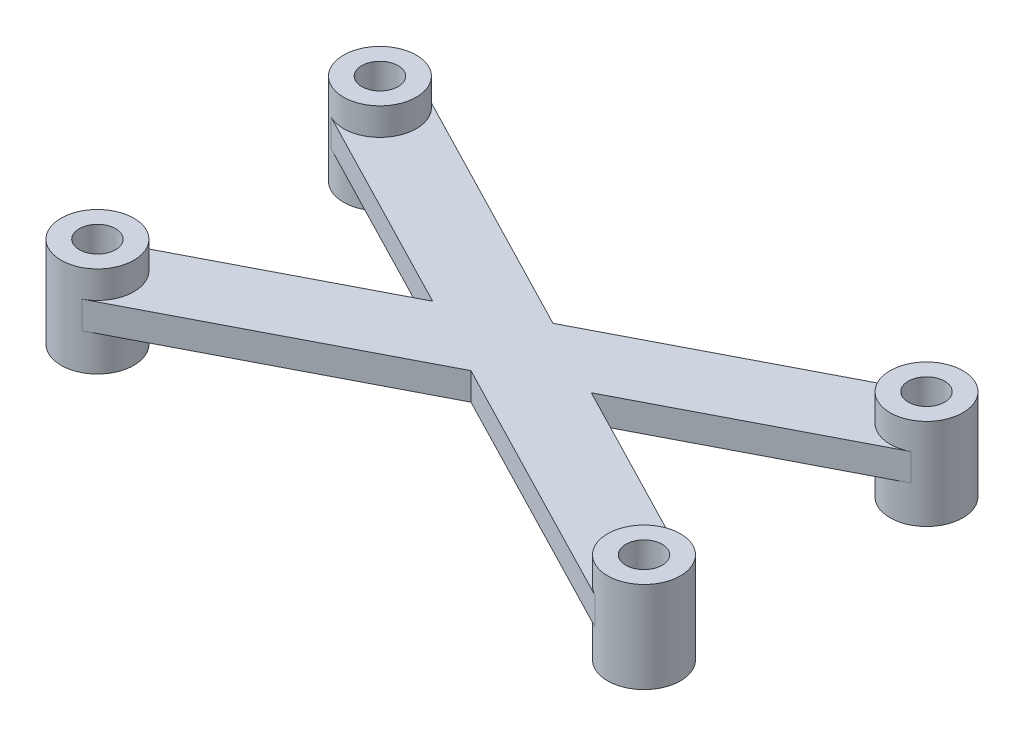
ISO-10303-21;
HEADER;
FILE_DESCRIPTION(('STEP AP214'),'2;1');
FILE_NAME('part.step','',(''),(''),'','','');
FILE_SCHEMA(('AUTOMOTIVE_DESIGN { 1 0 10303 214 1 1 1 1 }'));
ENDSEC;
DATA;
#1=APPLICATION_CONTEXT('core data for automotive mechanical design processes');
#2=APPLICATION_PROTOCOL_DEFINITION('international standard','automotive_design',2000,#1);
#3=PRODUCT_CONTEXT('',#1,'mechanical');
#4=PRODUCT('Part','Part','',(#3));
#5=PRODUCT_RELATED_PRODUCT_CATEGORY('part','',(#4));
#6=PRODUCT_DEFINITION_FORMATION('','',#4);
#7=PRODUCT_DEFINITION_CONTEXT('part definition',#1,'design');
#8=PRODUCT_DEFINITION('design','',#6,#7);
#9=PRODUCT_DEFINITION_SHAPE('','',#8);
#10=(LENGTH_UNIT() NAMED_UNIT(*) SI_UNIT(.MILLI.,.METRE.));
#11=(NAMED_UNIT(*) PLANE_ANGLE_UNIT() SI_UNIT($,.RADIAN.));
#12=(NAMED_UNIT(*) SI_UNIT($,.STERADIAN.) SOLID_ANGLE_UNIT());
#13=UNCERTAINTY_MEASURE_WITH_UNIT(LENGTH_MEASURE(1.E-05),#10,'distance_accuracy_value','');
#14=(GEOMETRIC_REPRESENTATION_CONTEXT(3) GLOBAL_UNCERTAINTY_ASSIGNED_CONTEXT((#13)) GLOBAL_UNIT_ASSIGNED_CONTEXT((#10,
#11,#12)) REPRESENTATION_CONTEXT('',''));
#15=CARTESIAN_POINT('',(0.,0.,0.));
#16=DIRECTION('',(0.,0.,1.));
#17=DIRECTION('',(1.,0.,0.));
#18=AXIS2_PLACEMENT_3D('',#15,#16,#17);
#19=CARTESIAN_POINT('',(0.,4.,0.));
#20=DIRECTION('',(0.,1.,0.));
#21=DIRECTION('',(0.,0.,1.));
#22=AXIS2_PLACEMENT_3D('',#19,#20,#21);
#23=PLANE('',#22);
#24=CARTESIAN_POINT('',(60.02,4.,31.02));
#25=DIRECTION('',(0.,1.,0.));
#26=DIRECTION('',(0.,0.,1.));
#27=AXIS2_PLACEMENT_3D('',#24,#25,#26);
#28=CIRCLE('',#27,4.);
#29=CARTESIAN_POINT('',(61.8565319194737,4.,27.4665297934619));
#30=VERTEX_POINT('',#29);
#31=CARTESIAN_POINT('',(58.1834680805263,4.,34.5734702065381));
#32=VERTEX_POINT('',#31);
#33=EDGE_CURVE('E489',#30,#32,#28,.T.);
#34=ORIENTED_EDGE('',*,*,#33,.T.);
#35=DIRECTION('',(-0.888367551634533,0.,-0.459132979868431));
#36=VECTOR('',#35,1.);
#37=CARTESIAN_POINT('',(-1.83653191947372,4.,3.55347020653813));
#38=LINE('',#37,#36);
#39=CARTESIAN_POINT('',(30.01,4.,20.012640818702));
#40=VERTEX_POINT('',#39);
#41=EDGE_CURVE('E377',#32,#40,#38,.T.);
#42=ORIENTED_EDGE('',*,*,#41,.T.);
#43=DIRECTION('',(0.888367551634533,0.,-0.459132979868431));
#44=VECTOR('',#43,1.);
#45=CARTESIAN_POINT('',(14.4889335735097,4.,28.0343582553853));
#46=LINE('',#45,#44);
#47=CARTESIAN_POINT('',(1.83653191947373,4.,34.5734702065381));
#48=VERTEX_POINT('',#47);
#49=EDGE_CURVE('E373',#48,#40,#46,.T.);
#50=ORIENTED_EDGE('',*,*,#49,.F.);
#51=CARTESIAN_POINT('',(0.,4.,31.02));
#52=DIRECTION('',(0.,1.,0.));
#53=DIRECTION('',(0.,0.,1.));
#54=AXIS2_PLACEMENT_3D('',#51,#52,#53);
#55=CIRCLE('',#54,4.);
#56=CARTESIAN_POINT('',(-1.83653191947371,4.,27.4665297934619));
#57=VERTEX_POINT('',#56);
#58=EDGE_CURVE('E512',#48,#57,#55,.T.);
#59=ORIENTED_EDGE('',*,*,#58,.T.);
#60=DIRECTION('',(0.888367551634533,0.,-0.459132979868431));
#61=VECTOR('',#60,1.);
#62=CARTESIAN_POINT('',(10.8158697345622,4.,20.927417842309));
#63=LINE('',#62,#61);
#64=CARTESIAN_POINT('',(21.2979270812865,4.,15.51));
#65=VERTEX_POINT('',#64);
#66=EDGE_CURVE('E368',#57,#65,#63,.T.);
#67=ORIENTED_EDGE('',*,*,#66,.T.);
#68=DIRECTION('',(0.888367551634533,0.,0.459132979868431));
#69=VECTOR('',#68,1.);
#70=CARTESIAN_POINT('',(-1.83653191947372,4.,3.55347020653813));
#71=LINE('',#70,#69);
#72=CARTESIAN_POINT('',(-1.83653191947372,4.,3.55347020653813));
#73=VERTEX_POINT('',#72);
#74=EDGE_CURVE('E364',#73,#65,#71,.T.);
#75=ORIENTED_EDGE('',*,*,#74,.F.);
#76=CARTESIAN_POINT('',(0.,4.,0.));
#77=DIRECTION('',(0.,1.,0.));
#78=DIRECTION('',(0.,0.,1.));
#79=AXIS2_PLACEMENT_3D('',#76,#77,#78);
#80=CIRCLE('',#79,4.);
#81=CARTESIAN_POINT('',(1.83653191947372,4.,-3.55347020653813));
#82=VERTEX_POINT('',#81);
#83=EDGE_CURVE('E263',#73,#82,#80,.T.);
#84=ORIENTED_EDGE('',*,*,#83,.T.);
#85=DIRECTION('',(0.888367551634533,0.,0.459132979868431));
#86=VECTOR('',#85,1.);
#87=CARTESIAN_POINT('',(1.83653191947372,4.,-3.55347020653813));
#88=LINE('',#87,#86);
#89=CARTESIAN_POINT('',(30.01,4.,11.007359181298));
#90=VERTEX_POINT('',#89);
#91=EDGE_CURVE('E392',#82,#90,#88,.T.);
#92=ORIENTED_EDGE('',*,*,#91,.T.);
#93=DIRECTION('',(-0.888367551634533,0.,0.459132979868431));
#94=VECTOR('',#93,1.);
#95=CARTESIAN_POINT('',(10.8158697345622,4.,20.927417842309));
#96=LINE('',#95,#94);
#97=CARTESIAN_POINT('',(58.1834680805263,4.,-3.55347020653813));
#98=VERTEX_POINT('',#97);
#99=EDGE_CURVE('E389',#98,#90,#96,.T.);
#100=ORIENTED_EDGE('',*,*,#99,.F.);
#101=CARTESIAN_POINT('',(60.02,4.,0.));
#102=DIRECTION('',(0.,1.,0.));
#103=DIRECTION('',(0.,0.,1.));
#104=AXIS2_PLACEMENT_3D('',#101,#102,#103);
#105=CIRCLE('',#104,4.00000000000001);
#106=CARTESIAN_POINT('',(61.8565319194737,4.,3.55347020653813));
#107=VERTEX_POINT('',#106);
#108=EDGE_CURVE('E343',#98,#107,#105,.T.);
#109=ORIENTED_EDGE('',*,*,#108,.T.);
#110=DIRECTION('',(-0.888367551634533,0.,0.459132979868431));
#111=VECTOR('',#110,1.);
#112=CARTESIAN_POINT('',(14.4889335735097,4.,28.0343582553853));
#113=LINE('',#112,#111);
#114=CARTESIAN_POINT('',(38.7220729187136,4.,15.51));
#115=VERTEX_POINT('',#114);
#116=EDGE_CURVE('E385',#107,#115,#113,.T.);
#117=ORIENTED_EDGE('',*,*,#116,.T.);
#118=DIRECTION('',(-0.888367551634533,0.,-0.459132979868431));
#119=VECTOR('',#118,1.);
#120=CARTESIAN_POINT('',(1.83653191947374,4.,-3.55347020653815));
#121=LINE('',#120,#119);
#122=EDGE_CURVE('E381',#30,#115,#121,.T.);
#123=ORIENTED_EDGE('',*,*,#122,.F.);
#124=EDGE_LOOP('',(#34,#42,#50,#59,#67,#75,#84,#92,#100,#109,#117,#123));
#125=FACE_BOUND('',#124,.T.);
#126=ADVANCED_FACE('F245',(#125),#23,.F.);
#127=CARTESIAN_POINT('',(0.,0.,0.));
#128=DIRECTION('',(0.,1.,0.));
#129=DIRECTION('',(0.,0.,1.));
#130=AXIS2_PLACEMENT_3D('',#127,#128,#129);
#131=PLANE('',#130);
#132=CARTESIAN_POINT('',(0.,0.,0.));
#133=DIRECTION('',(0.,1.,0.));
#134=DIRECTION('',(0.,0.,1.));
#135=AXIS2_PLACEMENT_3D('',#132,#133,#134);
#136=CIRCLE('',#135,4.);
#137=CARTESIAN_POINT('',(0.,0.,4.));
#138=VERTEX_POINT('',#137);
#139=EDGE_CURVE('E249',#138,#138,#136,.T.);
#140=ORIENTED_EDGE('',*,*,#139,.F.);
#141=EDGE_LOOP('',(#140));
#142=FACE_BOUND('',#141,.T.);
#143=CARTESIAN_POINT('',(0.,0.,0.));
#144=DIRECTION('',(0.,1.,0.));
#145=DIRECTION('',(0.,0.,1.));
#146=AXIS2_PLACEMENT_3D('',#143,#144,#145);
#147=CIRCLE('',#146,2.);
#148=CARTESIAN_POINT('',(0.,0.,2.));
#149=VERTEX_POINT('',#148);
#150=EDGE_CURVE('E428',#149,#149,#147,.T.);
#151=ORIENTED_EDGE('',*,*,#150,.T.);
#152=EDGE_LOOP('',(#151));
#153=FACE_BOUND('',#152,.T.);
#154=ADVANCED_FACE('F438',(#142,#153),#131,.F.);
#155=CARTESIAN_POINT('',(0.,4.,0.));
#156=DIRECTION('',(0.,-1.,0.));
#157=DIRECTION('',(0.,0.,-1.));
#158=AXIS2_PLACEMENT_3D('',#155,#156,#157);
#159=CYLINDRICAL_SURFACE('',#158,4.);
#160=ORIENTED_EDGE('',*,*,#83,.F.);
#161=DIRECTION('',(0.,-1.,0.));
#162=VECTOR('',#161,1.);
#163=CARTESIAN_POINT('',(-1.83653191947372,7.,3.55347020653813));
#164=LINE('',#163,#162);
#165=CARTESIAN_POINT('',(-1.83653191947372,7.,3.55347020653813));
#166=VERTEX_POINT('',#165);
#167=EDGE_CURVE('E358',#166,#73,#164,.T.);
#168=ORIENTED_EDGE('',*,*,#167,.F.);
#169=CARTESIAN_POINT('',(0.,7.,0.));
#170=DIRECTION('',(0.,1.,0.));
#171=DIRECTION('',(0.,0.,1.));
#172=AXIS2_PLACEMENT_3D('',#169,#170,#171);
#173=CIRCLE('',#172,4.);
#174=CARTESIAN_POINT('',(1.83653191947372,7.,-3.55347020653813));
#175=VERTEX_POINT('',#174);
#176=EDGE_CURVE('E12',#166,#175,#173,.T.);
#177=ORIENTED_EDGE('',*,*,#176,.T.);
#178=DIRECTION('',(0.,-1.,0.));
#179=VECTOR('',#178,1.);
#180=CARTESIAN_POINT('',(1.83653191947372,7.,-3.55347020653813));
#181=LINE('',#180,#179);
#182=EDGE_CURVE('E397',#175,#82,#181,.T.);
#183=ORIENTED_EDGE('',*,*,#182,.T.);
#184=EDGE_LOOP('',(#160,#168,#177,#183));
#185=FACE_BOUND('',#184,.T.);
#186=ORIENTED_EDGE('',*,*,#139,.T.);
#187=EDGE_LOOP('',(#186));
#188=FACE_BOUND('',#187,.T.);
#189=CARTESIAN_POINT('',(0.,10.,0.));
#190=DIRECTION('',(0.,1.,0.));
#191=DIRECTION('',(0.,0.,1.));
#192=AXIS2_PLACEMENT_3D('',#189,#190,#191);
#193=CIRCLE('',#192,4.);
#194=CARTESIAN_POINT('',(0.,10.,4.));
#195=VERTEX_POINT('',#194);
#196=EDGE_CURVE('E454',#195,#195,#193,.T.);
#197=ORIENTED_EDGE('',*,*,#196,.F.);
#198=EDGE_LOOP('',(#197));
#199=FACE_BOUND('',#198,.T.);
#200=ADVANCED_FACE('F247',(#185,#188,#199),#159,.T.);
#201=CARTESIAN_POINT('',(0.,4.,0.));
#202=DIRECTION('',(0.,-1.,0.));
#203=DIRECTION('',(0.,0.,-1.));
#204=AXIS2_PLACEMENT_3D('',#201,#202,#203);
#205=CYLINDRICAL_SURFACE('',#204,2.);
#206=ORIENTED_EDGE('',*,*,#150,.F.);
#207=EDGE_LOOP('',(#206));
#208=FACE_BOUND('',#207,.T.);
#209=CARTESIAN_POINT('',(0.,10.,0.));
#210=DIRECTION('',(0.,1.,0.));
#211=DIRECTION('',(0.,0.,1.));
#212=AXIS2_PLACEMENT_3D('',#209,#210,#211);
#213=CIRCLE('',#212,2.);
#214=CARTESIAN_POINT('',(0.,10.,2.));
#215=VERTEX_POINT('',#214);
#216=EDGE_CURVE('E450',#215,#215,#213,.T.);
#217=ORIENTED_EDGE('',*,*,#216,.T.);
#218=EDGE_LOOP('',(#217));
#219=FACE_BOUND('',#218,.T.);
#220=ADVANCED_FACE('F443',(#208,#219),#205,.F.);
#221=CARTESIAN_POINT('',(60.02,7.,31.02));
#222=DIRECTION('',(0.,-1.,0.));
#223=DIRECTION('',(0.,0.,-1.));
#224=AXIS2_PLACEMENT_3D('',#221,#222,#223);
#225=CYLINDRICAL_SURFACE('',#224,2.);
#226=CARTESIAN_POINT('',(60.02,0.,31.02));
#227=DIRECTION('',(0.,1.,0.));
#228=DIRECTION('',(0.,0.,1.));
#229=AXIS2_PLACEMENT_3D('',#226,#227,#228);
#230=CIRCLE('',#229,2.);
#231=CARTESIAN_POINT('',(60.02,0.,33.02));
#232=VERTEX_POINT('',#231);
#233=EDGE_CURVE('E495',#232,#232,#230,.T.);
#234=ORIENTED_EDGE('',*,*,#233,.F.);
#235=EDGE_LOOP('',(#234));
#236=FACE_BOUND('',#235,.T.);
#237=CARTESIAN_POINT('',(60.02,10.,31.02));
#238=DIRECTION('',(0.,1.,0.));
#239=DIRECTION('',(0.,0.,1.));
#240=AXIS2_PLACEMENT_3D('',#237,#238,#239);
#241=CIRCLE('',#240,2.);
#242=CARTESIAN_POINT('',(60.02,10.,33.02));
#243=VERTEX_POINT('',#242);
#244=EDGE_CURVE('E472',#243,#243,#241,.T.);
#245=ORIENTED_EDGE('',*,*,#244,.T.);
#246=EDGE_LOOP('',(#245));
#247=FACE_BOUND('',#246,.T.);
#248=ADVANCED_FACE('F446',(#236,#247),#225,.F.);
#249=CARTESIAN_POINT('',(0.,7.,31.02));
#250=DIRECTION('',(0.,-1.,0.));
#251=DIRECTION('',(0.,0.,-1.));
#252=AXIS2_PLACEMENT_3D('',#249,#250,#251);
#253=CYLINDRICAL_SURFACE('',#252,2.);
#254=CARTESIAN_POINT('',(0.,0.,31.02));
#255=DIRECTION('',(0.,1.,0.));
#256=DIRECTION('',(0.,0.,1.));
#257=AXIS2_PLACEMENT_3D('',#254,#255,#256);
#258=CIRCLE('',#257,2.);
#259=CARTESIAN_POINT('',(0.,0.,33.02));
#260=VERTEX_POINT('',#259);
#261=EDGE_CURVE('E369',#260,#260,#258,.T.);
#262=ORIENTED_EDGE('',*,*,#261,.F.);
#263=EDGE_LOOP('',(#262));
#264=FACE_BOUND('',#263,.T.);
#265=CARTESIAN_POINT('',(0.,10.,31.02));
#266=DIRECTION('',(0.,1.,0.));
#267=DIRECTION('',(0.,0.,1.));
#268=AXIS2_PLACEMENT_3D('',#265,#266,#267);
#269=CIRCLE('',#268,2.);
#270=CARTESIAN_POINT('',(0.,10.,33.02));
#271=VERTEX_POINT('',#270);
#272=EDGE_CURVE('E462',#271,#271,#269,.T.);
#273=ORIENTED_EDGE('',*,*,#272,.T.);
#274=EDGE_LOOP('',(#273));
#275=FACE_BOUND('',#274,.T.);
#276=ADVANCED_FACE('F594',(#264,#275),#253,.F.);
#277=CARTESIAN_POINT('',(60.02,7.,0.));
#278=DIRECTION('',(0.,-1.,0.));
#279=DIRECTION('',(0.,0.,-1.));
#280=AXIS2_PLACEMENT_3D('',#277,#278,#279);
#281=CYLINDRICAL_SURFACE('',#280,2.);
#282=CARTESIAN_POINT('',(60.02,0.,0.));
#283=DIRECTION('',(0.,1.,0.));
#284=DIRECTION('',(0.,0.,1.));
#285=AXIS2_PLACEMENT_3D('',#282,#283,#284);
#286=CIRCLE('',#285,2.);
#287=CARTESIAN_POINT('',(60.02,0.,2.));
#288=VERTEX_POINT('',#287);
#289=EDGE_CURVE('E506',#288,#288,#286,.T.);
#290=ORIENTED_EDGE('',*,*,#289,.F.);
#291=EDGE_LOOP('',(#290));
#292=FACE_BOUND('',#291,.T.);
#293=CARTESIAN_POINT('',(60.02,10.,0.));
#294=DIRECTION('',(0.,1.,0.));
#295=DIRECTION('',(0.,0.,1.));
#296=AXIS2_PLACEMENT_3D('',#293,#294,#295);
#297=CIRCLE('',#296,2.);
#298=CARTESIAN_POINT('',(60.02,10.,2.));
#299=VERTEX_POINT('',#298);
#300=EDGE_CURVE('E453',#299,#299,#297,.T.);
#301=ORIENTED_EDGE('',*,*,#300,.T.);
#302=EDGE_LOOP('',(#301));
#303=FACE_BOUND('',#302,.T.);
#304=ADVANCED_FACE('F598',(#292,#303),#281,.F.);
#305=CARTESIAN_POINT('',(10.8158697345622,7.,20.927417842309));
#306=DIRECTION('',(-0.459132979868431,0.,-0.888367551634533));
#307=DIRECTION('',(-0.888367551634533,0.,0.459132979868431));
#308=AXIS2_PLACEMENT_3D('',#305,#306,#307);
#309=PLANE('',#308);
#310=ORIENTED_EDGE('',*,*,#66,.F.);
#311=DIRECTION('',(0.,-1.,0.));
#312=VECTOR('',#311,1.);
#313=CARTESIAN_POINT('',(-1.8365319194737,7.,27.4665297934619));
#314=LINE('',#313,#312);
#315=CARTESIAN_POINT('',(-1.8365319194737,7.,27.4665297934619));
#316=VERTEX_POINT('',#315);
#317=EDGE_CURVE('E421',#316,#57,#314,.T.);
#318=ORIENTED_EDGE('',*,*,#317,.F.);
#319=DIRECTION('',(0.888367551634533,0.,-0.459132979868431));
#320=VECTOR('',#319,1.);
#321=CARTESIAN_POINT('',(10.8158697345622,7.,20.927417842309));
#322=LINE('',#321,#320);
#323=CARTESIAN_POINT('',(21.2979270812865,7.,15.51));
#324=VERTEX_POINT('',#323);
#325=EDGE_CURVE('E525',#316,#324,#322,.T.);
#326=ORIENTED_EDGE('',*,*,#325,.T.);
#327=DIRECTION('',(0.,-1.,0.));
#328=VECTOR('',#327,1.);
#329=CARTESIAN_POINT('',(21.2979270812865,7.,15.51));
#330=LINE('',#329,#328);
#331=EDGE_CURVE('E425',#324,#65,#330,.T.);
#332=ORIENTED_EDGE('',*,*,#331,.T.);
#333=EDGE_LOOP('',(#310,#318,#326,#332));
#334=FACE_BOUND('',#333,.T.);
#335=ADVANCED_FACE('F566',(#334),#309,.T.);
#336=CARTESIAN_POINT('',(0.,7.,31.02));
#337=DIRECTION('',(0.,-1.,0.));
#338=DIRECTION('',(0.,0.,-1.));
#339=AXIS2_PLACEMENT_3D('',#336,#337,#338);
#340=CYLINDRICAL_SURFACE('',#339,4.);
#341=ORIENTED_EDGE('',*,*,#317,.T.);
#342=ORIENTED_EDGE('',*,*,#58,.F.);
#343=DIRECTION('',(0.,-1.,0.));
#344=VECTOR('',#343,1.);
#345=CARTESIAN_POINT('',(1.83653191947373,7.,34.5734702065381));
#346=LINE('',#345,#344);
#347=CARTESIAN_POINT('',(1.83653191947373,7.,34.5734702065381));
#348=VERTEX_POINT('',#347);
#349=EDGE_CURVE('E418',#348,#48,#346,.T.);
#350=ORIENTED_EDGE('',*,*,#349,.F.);
#351=CARTESIAN_POINT('',(0.,7.,31.02));
#352=DIRECTION('',(0.,1.,0.));
#353=DIRECTION('',(0.,0.,1.));
#354=AXIS2_PLACEMENT_3D('',#351,#352,#353);
#355=CIRCLE('',#354,3.99999999999999);
#356=EDGE_CURVE('E465',#348,#316,#355,.T.);
#357=ORIENTED_EDGE('',*,*,#356,.T.);
#358=EDGE_LOOP('',(#341,#342,#350,#357));
#359=FACE_BOUND('',#358,.T.);
#360=CARTESIAN_POINT('',(0.,0.,31.02));
#361=DIRECTION('',(0.,1.,0.));
#362=DIRECTION('',(0.,0.,1.));
#363=AXIS2_PLACEMENT_3D('',#360,#361,#362);
#364=CIRCLE('',#363,4.);
#365=CARTESIAN_POINT('',(0.,0.,35.02));
#366=VERTEX_POINT('',#365);
#367=EDGE_CURVE('E513',#366,#366,#364,.T.);
#368=ORIENTED_EDGE('',*,*,#367,.T.);
#369=EDGE_LOOP('',(#368));
#370=FACE_BOUND('',#369,.T.);
#371=CARTESIAN_POINT('',(0.,10.,31.02));
#372=DIRECTION('',(0.,1.,0.));
#373=DIRECTION('',(0.,0.,1.));
#374=AXIS2_PLACEMENT_3D('',#371,#372,#373);
#375=CIRCLE('',#374,3.99999999999999);
#376=CARTESIAN_POINT('',(0.,10.,35.02));
#377=VERTEX_POINT('',#376);
#378=EDGE_CURVE('E468',#377,#377,#375,.T.);
#379=ORIENTED_EDGE('',*,*,#378,.F.);
#380=EDGE_LOOP('',(#379));
#381=FACE_BOUND('',#380,.T.);
#382=ADVANCED_FACE('F572',(#359,#370,#381),#340,.T.);
#383=CARTESIAN_POINT('',(14.4889335735097,7.,28.0343582553853));
#384=DIRECTION('',(-0.459132979868431,0.,-0.888367551634533));
#385=DIRECTION('',(-0.888367551634534,0.,0.459132979868431));
#386=AXIS2_PLACEMENT_3D('',#383,#384,#385);
#387=PLANE('',#386);
#388=ORIENTED_EDGE('',*,*,#49,.T.);
#389=DIRECTION('',(0.,-1.,0.));
#390=VECTOR('',#389,1.);
#391=CARTESIAN_POINT('',(30.01,7.,20.012640818702));
#392=LINE('',#391,#390);
#393=CARTESIAN_POINT('',(30.01,7.,20.012640818702));
#394=VERTEX_POINT('',#393);
#395=EDGE_CURVE('E415',#394,#40,#392,.T.);
#396=ORIENTED_EDGE('',*,*,#395,.F.);
#397=DIRECTION('',(0.888367551634533,0.,-0.459132979868431));
#398=VECTOR('',#397,1.);
#399=CARTESIAN_POINT('',(14.4889335735097,7.,28.0343582553853));
#400=LINE('',#399,#398);
#401=EDGE_CURVE('E529',#348,#394,#400,.T.);
#402=ORIENTED_EDGE('',*,*,#401,.F.);
#403=ORIENTED_EDGE('',*,*,#349,.T.);
#404=EDGE_LOOP('',(#388,#396,#402,#403));
#405=FACE_BOUND('',#404,.T.);
#406=ADVANCED_FACE('F576',(#405),#387,.F.);
#407=CARTESIAN_POINT('',(-1.83653191947372,7.,3.55347020653813));
#408=DIRECTION('',(-0.459132979868431,0.,0.888367551634533));
#409=DIRECTION('',(0.888367551634533,0.,0.459132979868431));
#410=AXIS2_PLACEMENT_3D('',#407,#408,#409);
#411=PLANE('',#410);
#412=ORIENTED_EDGE('',*,*,#41,.F.);
#413=DIRECTION('',(0.,-1.,0.));
#414=VECTOR('',#413,1.);
#415=CARTESIAN_POINT('',(58.1834680805263,7.,34.5734702065381));
#416=LINE('',#415,#414);
#417=CARTESIAN_POINT('',(58.1834680805263,7.,34.5734702065381));
#418=VERTEX_POINT('',#417);
#419=EDGE_CURVE('E411',#418,#32,#416,.T.);
#420=ORIENTED_EDGE('',*,*,#419,.F.);
#421=DIRECTION('',(-0.888367551634533,0.,-0.459132979868431));
#422=VECTOR('',#421,1.);
#423=CARTESIAN_POINT('',(-1.83653191947372,7.,3.55347020653813));
#424=LINE('',#423,#422);
#425=EDGE_CURVE('E532',#418,#394,#424,.T.);
#426=ORIENTED_EDGE('',*,*,#425,.T.);
#427=ORIENTED_EDGE('',*,*,#395,.T.);
#428=EDGE_LOOP('',(#412,#420,#426,#427));
#429=FACE_BOUND('',#428,.T.);
#430=ADVANCED_FACE('F579',(#429),#411,.T.);
#431=CARTESIAN_POINT('',(60.02,7.,31.02));
#432=DIRECTION('',(0.,-1.,0.));
#433=DIRECTION('',(0.,0.,-1.));
#434=AXIS2_PLACEMENT_3D('',#431,#432,#433);
#435=CYLINDRICAL_SURFACE('',#434,3.99999999999999);
#436=ORIENTED_EDGE('',*,*,#419,.T.);
#437=ORIENTED_EDGE('',*,*,#33,.F.);
#438=DIRECTION('',(0.,-1.,0.));
#439=VECTOR('',#438,1.);
#440=CARTESIAN_POINT('',(61.8565319194737,7.,27.4665297934619));
#441=LINE('',#440,#439);
#442=CARTESIAN_POINT('',(61.8565319194737,7.,27.4665297934619));
#443=VERTEX_POINT('',#442);
#444=EDGE_CURVE('E407',#443,#30,#441,.T.);
#445=ORIENTED_EDGE('',*,*,#444,.F.);
#446=CARTESIAN_POINT('',(60.02,7.,31.02));
#447=DIRECTION('',(0.,1.,0.));
#448=DIRECTION('',(0.,0.,1.));
#449=AXIS2_PLACEMENT_3D('',#446,#447,#448);
#450=CIRCLE('',#449,4.);
#451=EDGE_CURVE('E476',#443,#418,#450,.T.);
#452=ORIENTED_EDGE('',*,*,#451,.T.);
#453=EDGE_LOOP('',(#436,#437,#445,#452));
#454=FACE_BOUND('',#453,.T.);
#455=CARTESIAN_POINT('',(60.02,0.,31.02));
#456=DIRECTION('',(0.,1.,0.));
#457=DIRECTION('',(0.,0.,1.));
#458=AXIS2_PLACEMENT_3D('',#455,#456,#457);
#459=CIRCLE('',#458,4.);
#460=CARTESIAN_POINT('',(60.02,0.,35.02));
#461=VERTEX_POINT('',#460);
#462=EDGE_CURVE('E491',#461,#461,#459,.T.);
#463=ORIENTED_EDGE('',*,*,#462,.T.);
#464=EDGE_LOOP('',(#463));
#465=FACE_BOUND('',#464,.T.);
#466=CARTESIAN_POINT('',(60.02,10.,31.02));
#467=DIRECTION('',(0.,1.,0.));
#468=DIRECTION('',(0.,0.,1.));
#469=AXIS2_PLACEMENT_3D('',#466,#467,#468);
#470=CIRCLE('',#469,4.);
#471=CARTESIAN_POINT('',(60.02,10.,35.02));
#472=VERTEX_POINT('',#471);
#473=EDGE_CURVE('E480',#472,#472,#470,.T.);
#474=ORIENTED_EDGE('',*,*,#473,.F.);
#475=EDGE_LOOP('',(#474));
#476=FACE_BOUND('',#475,.T.);
#477=ADVANCED_FACE('F581',(#454,#465,#476),#435,.T.);
#478=CARTESIAN_POINT('',(1.83653191947374,7.,-3.55347020653815));
#479=DIRECTION('',(-0.459132979868431,0.,0.888367551634533));
#480=DIRECTION('',(0.888367551634533,0.,0.459132979868431));
#481=AXIS2_PLACEMENT_3D('',#478,#479,#480);
#482=PLANE('',#481);
#483=ORIENTED_EDGE('',*,*,#122,.T.);
#484=DIRECTION('',(0.,-1.,0.));
#485=VECTOR('',#484,1.);
#486=CARTESIAN_POINT('',(38.7220729187136,7.,15.51));
#487=LINE('',#486,#485);
#488=CARTESIAN_POINT('',(38.7220729187136,7.,15.51));
#489=VERTEX_POINT('',#488);
#490=EDGE_CURVE('E404',#489,#115,#487,.T.);
#491=ORIENTED_EDGE('',*,*,#490,.F.);
#492=DIRECTION('',(-0.888367551634533,0.,-0.459132979868431));
#493=VECTOR('',#492,1.);
#494=CARTESIAN_POINT('',(1.83653191947374,7.,-3.55347020653815));
#495=LINE('',#494,#493);
#496=EDGE_CURVE('E360',#443,#489,#495,.T.);
#497=ORIENTED_EDGE('',*,*,#496,.F.);
#498=ORIENTED_EDGE('',*,*,#444,.T.);
#499=EDGE_LOOP('',(#483,#491,#497,#498));
#500=FACE_BOUND('',#499,.T.);
#501=ADVANCED_FACE('F542',(#500),#482,.F.);
#502=CARTESIAN_POINT('',(14.4889335735097,7.,28.0343582553853));
#503=DIRECTION('',(0.459132979868431,0.,0.888367551634533));
#504=DIRECTION('',(0.888367551634533,0.,-0.459132979868431));
#505=AXIS2_PLACEMENT_3D('',#502,#503,#504);
#506=PLANE('',#505);
#507=ORIENTED_EDGE('',*,*,#116,.F.);
#508=DIRECTION('',(0.,-1.,0.));
#509=VECTOR('',#508,1.);
#510=CARTESIAN_POINT('',(61.8565319194737,7.,3.55347020653813));
#511=LINE('',#510,#509);
#512=CARTESIAN_POINT('',(61.8565319194737,7.,3.55347020653813));
#513=VERTEX_POINT('',#512);
#514=EDGE_CURVE('E348',#513,#107,#511,.T.);
#515=ORIENTED_EDGE('',*,*,#514,.F.);
#516=DIRECTION('',(-0.888367551634533,0.,0.459132979868431));
#517=VECTOR('',#516,1.);
#518=CARTESIAN_POINT('',(14.4889335735097,7.,28.0343582553853));
#519=LINE('',#518,#517);
#520=EDGE_CURVE('E332',#513,#489,#519,.T.);
#521=ORIENTED_EDGE('',*,*,#520,.T.);
#522=ORIENTED_EDGE('',*,*,#490,.T.);
#523=EDGE_LOOP('',(#507,#515,#521,#522));
#524=FACE_BOUND('',#523,.T.);
#525=ADVANCED_FACE('F546',(#524),#506,.T.);
#526=CARTESIAN_POINT('',(60.02,7.,0.));
#527=DIRECTION('',(0.,-1.,0.));
#528=DIRECTION('',(0.,0.,-1.));
#529=AXIS2_PLACEMENT_3D('',#526,#527,#528);
#530=CYLINDRICAL_SURFACE('',#529,4.);
#531=ORIENTED_EDGE('',*,*,#514,.T.);
#532=ORIENTED_EDGE('',*,*,#108,.F.);
#533=DIRECTION('',(0.,-1.,0.));
#534=VECTOR('',#533,1.);
#535=CARTESIAN_POINT('',(58.1834680805263,7.,-3.55347020653813));
#536=LINE('',#535,#534);
#537=CARTESIAN_POINT('',(58.1834680805263,7.,-3.55347020653813));
#538=VERTEX_POINT('',#537);
#539=EDGE_CURVE('E339',#538,#98,#536,.T.);
#540=ORIENTED_EDGE('',*,*,#539,.F.);
#541=CARTESIAN_POINT('',(60.02,7.,0.));
#542=DIRECTION('',(0.,1.,0.));
#543=DIRECTION('',(0.,0.,1.));
#544=AXIS2_PLACEMENT_3D('',#541,#542,#543);
#545=CIRCLE('',#544,3.99999999999999);
#546=EDGE_CURVE('E255',#538,#513,#545,.T.);
#547=ORIENTED_EDGE('',*,*,#546,.T.);
#548=EDGE_LOOP('',(#531,#532,#540,#547));
#549=FACE_BOUND('',#548,.T.);
#550=CARTESIAN_POINT('',(60.02,0.,0.));
#551=DIRECTION('',(0.,1.,0.));
#552=DIRECTION('',(0.,0.,1.));
#553=AXIS2_PLACEMENT_3D('',#550,#551,#552);
#554=CIRCLE('',#553,4.00000000000001);
#555=CARTESIAN_POINT('',(60.02,0.,4.00000000000001));
#556=VERTEX_POINT('',#555);
#557=EDGE_CURVE('E502',#556,#556,#554,.T.);
#558=ORIENTED_EDGE('',*,*,#557,.T.);
#559=EDGE_LOOP('',(#558));
#560=FACE_BOUND('',#559,.T.);
#561=CARTESIAN_POINT('',(60.02,10.,0.));
#562=DIRECTION('',(0.,1.,0.));
#563=DIRECTION('',(0.,0.,1.));
#564=AXIS2_PLACEMENT_3D('',#561,#562,#563);
#565=CIRCLE('',#564,3.99999999999999);
#566=CARTESIAN_POINT('',(60.02,10.,3.99999999999999));
#567=VERTEX_POINT('',#566);
#568=EDGE_CURVE('E459',#567,#567,#565,.T.);
#569=ORIENTED_EDGE('',*,*,#568,.F.);
#570=EDGE_LOOP('',(#569));
#571=FACE_BOUND('',#570,.T.);
#572=ADVANCED_FACE('F340',(#549,#560,#571),#530,.T.);
#573=CARTESIAN_POINT('',(10.8158697345622,7.,20.927417842309));
#574=DIRECTION('',(0.459132979868431,0.,0.888367551634533));
#575=DIRECTION('',(0.888367551634533,0.,-0.459132979868431));
#576=AXIS2_PLACEMENT_3D('',#573,#574,#575);
#577=PLANE('',#576);
#578=ORIENTED_EDGE('',*,*,#99,.T.);
#579=DIRECTION('',(0.,-1.,0.));
#580=VECTOR('',#579,1.);
#581=CARTESIAN_POINT('',(30.01,7.,11.007359181298));
#582=LINE('',#581,#580);
#583=CARTESIAN_POINT('',(30.01,7.,11.007359181298));
#584=VERTEX_POINT('',#583);
#585=EDGE_CURVE('E349',#584,#90,#582,.T.);
#586=ORIENTED_EDGE('',*,*,#585,.F.);
#587=DIRECTION('',(-0.888367551634533,0.,0.459132979868431));
#588=VECTOR('',#587,1.);
#589=CARTESIAN_POINT('',(10.8158697345622,7.,20.927417842309));
#590=LINE('',#589,#588);
#591=EDGE_CURVE('E328',#538,#584,#590,.T.);
#592=ORIENTED_EDGE('',*,*,#591,.F.);
#593=ORIENTED_EDGE('',*,*,#539,.T.);
#594=EDGE_LOOP('',(#578,#586,#592,#593));
#595=FACE_BOUND('',#594,.T.);
#596=ADVANCED_FACE('F351',(#595),#577,.F.);
#597=CARTESIAN_POINT('',(1.83653191947372,7.,-3.55347020653813));
#598=DIRECTION('',(0.459132979868431,0.,-0.888367551634533));
#599=DIRECTION('',(-0.888367551634534,0.,-0.459132979868431));
#600=AXIS2_PLACEMENT_3D('',#597,#598,#599);
#601=PLANE('',#600);
#602=ORIENTED_EDGE('',*,*,#91,.F.);
#603=ORIENTED_EDGE('',*,*,#182,.F.);
#604=DIRECTION('',(0.888367551634533,0.,0.459132979868431));
#605=VECTOR('',#604,1.);
#606=CARTESIAN_POINT('',(1.83653191947372,7.,-3.55347020653813));
#607=LINE('',#606,#605);
#608=EDGE_CURVE('E354',#175,#584,#607,.T.);
#609=ORIENTED_EDGE('',*,*,#608,.T.);
#610=ORIENTED_EDGE('',*,*,#585,.T.);
#611=EDGE_LOOP('',(#602,#603,#609,#610));
#612=FACE_BOUND('',#611,.T.);
#613=ADVANCED_FACE('F561',(#612),#601,.T.);
#614=CARTESIAN_POINT('',(-1.83653191947372,7.,3.55347020653813));
#615=DIRECTION('',(0.45913297986843,0.,-0.888367551634533));
#616=DIRECTION('',(-0.888367551634534,0.,-0.459132979868431));
#617=AXIS2_PLACEMENT_3D('',#614,#615,#616);
#618=PLANE('',#617);
#619=ORIENTED_EDGE('',*,*,#74,.T.);
#620=ORIENTED_EDGE('',*,*,#331,.F.);
#621=DIRECTION('',(0.888367551634533,0.,0.459132979868431));
#622=VECTOR('',#621,1.);
#623=CARTESIAN_POINT('',(-1.83653191947372,7.,3.55347020653813));
#624=LINE('',#623,#622);
#625=EDGE_CURVE('E306',#166,#324,#624,.T.);
#626=ORIENTED_EDGE('',*,*,#625,.F.);
#627=ORIENTED_EDGE('',*,*,#167,.T.);
#628=EDGE_LOOP('',(#619,#620,#626,#627));
#629=FACE_BOUND('',#628,.T.);
#630=ADVANCED_FACE('F563',(#629),#618,.F.);
#631=CARTESIAN_POINT('',(0.,7.,0.));
#632=DIRECTION('',(0.,1.,0.));
#633=DIRECTION('',(0.,0.,1.));
#634=AXIS2_PLACEMENT_3D('',#631,#632,#633);
#635=PLANE('',#634);
#636=ORIENTED_EDGE('',*,*,#451,.F.);
#637=ORIENTED_EDGE('',*,*,#496,.T.);
#638=ORIENTED_EDGE('',*,*,#520,.F.);
#639=ORIENTED_EDGE('',*,*,#546,.F.);
#640=ORIENTED_EDGE('',*,*,#591,.T.);
#641=ORIENTED_EDGE('',*,*,#608,.F.);
#642=ORIENTED_EDGE('',*,*,#176,.F.);
#643=ORIENTED_EDGE('',*,*,#625,.T.);
#644=ORIENTED_EDGE('',*,*,#325,.F.);
#645=ORIENTED_EDGE('',*,*,#356,.F.);
#646=ORIENTED_EDGE('',*,*,#401,.T.);
#647=ORIENTED_EDGE('',*,*,#425,.F.);
#648=EDGE_LOOP('',(#636,#637,#638,#639,#640,#641,#642,#643,#644,#645,#646,#647));
#649=FACE_BOUND('',#648,.T.);
#650=ADVANCED_FACE('F326',(#649),#635,.T.);
#651=CARTESIAN_POINT('',(0.,0.,31.02));
#652=DIRECTION('',(0.,1.,0.));
#653=DIRECTION('',(0.,0.,1.));
#654=AXIS2_PLACEMENT_3D('',#651,#652,#653);
#655=PLANE('',#654);
#656=ORIENTED_EDGE('',*,*,#367,.F.);
#657=EDGE_LOOP('',(#656));
#658=FACE_BOUND('',#657,.T.);
#659=ORIENTED_EDGE('',*,*,#261,.T.);
#660=EDGE_LOOP('',(#659));
#661=FACE_BOUND('',#660,.T.);
#662=ADVANCED_FACE('F627',(#658,#661),#655,.F.);
#663=CARTESIAN_POINT('',(60.02,0.,0.));
#664=DIRECTION('',(0.,1.,0.));
#665=DIRECTION('',(0.,0.,1.));
#666=AXIS2_PLACEMENT_3D('',#663,#664,#665);
#667=PLANE('',#666);
#668=ORIENTED_EDGE('',*,*,#557,.F.);
#669=EDGE_LOOP('',(#668));
#670=FACE_BOUND('',#669,.T.);
#671=ORIENTED_EDGE('',*,*,#289,.T.);
#672=EDGE_LOOP('',(#671));
#673=FACE_BOUND('',#672,.T.);
#674=ADVANCED_FACE('F632',(#670,#673),#667,.F.);
#675=CARTESIAN_POINT('',(60.02,0.,31.02));
#676=DIRECTION('',(0.,1.,0.));
#677=DIRECTION('',(0.,0.,1.));
#678=AXIS2_PLACEMENT_3D('',#675,#676,#677);
#679=PLANE('',#678);
#680=ORIENTED_EDGE('',*,*,#462,.F.);
#681=EDGE_LOOP('',(#680));
#682=FACE_BOUND('',#681,.T.);
#683=ORIENTED_EDGE('',*,*,#233,.T.);
#684=EDGE_LOOP('',(#683));
#685=FACE_BOUND('',#684,.T.);
#686=ADVANCED_FACE('F637',(#682,#685),#679,.F.);
#687=CARTESIAN_POINT('',(60.02,10.,0.));
#688=DIRECTION('',(0.,1.,0.));
#689=DIRECTION('',(0.,0.,1.));
#690=AXIS2_PLACEMENT_3D('',#687,#688,#689);
#691=PLANE('',#690);
#692=ORIENTED_EDGE('',*,*,#568,.T.);
#693=EDGE_LOOP('',(#692));
#694=FACE_BOUND('',#693,.T.);
#695=ORIENTED_EDGE('',*,*,#300,.F.);
#696=EDGE_LOOP('',(#695));
#697=FACE_BOUND('',#696,.T.);
#698=ADVANCED_FACE('F644',(#694,#697),#691,.T.);
#699=CARTESIAN_POINT('',(0.,10.,0.));
#700=DIRECTION('',(0.,1.,0.));
#701=DIRECTION('',(0.,0.,1.));
#702=AXIS2_PLACEMENT_3D('',#699,#700,#701);
#703=PLANE('',#702);
#704=ORIENTED_EDGE('',*,*,#196,.T.);
#705=EDGE_LOOP('',(#704));
#706=FACE_BOUND('',#705,.T.);
#707=ORIENTED_EDGE('',*,*,#216,.F.);
#708=EDGE_LOOP('',(#707));
#709=FACE_BOUND('',#708,.T.);
#710=ADVANCED_FACE('F647',(#706,#709),#703,.T.);
#711=CARTESIAN_POINT('',(0.,10.,31.02));
#712=DIRECTION('',(0.,1.,0.));
#713=DIRECTION('',(0.,0.,1.));
#714=AXIS2_PLACEMENT_3D('',#711,#712,#713);
#715=PLANE('',#714);
#716=ORIENTED_EDGE('',*,*,#378,.T.);
#717=EDGE_LOOP('',(#716));
#718=FACE_BOUND('',#717,.T.);
#719=ORIENTED_EDGE('',*,*,#272,.F.);
#720=EDGE_LOOP('',(#719));
#721=FACE_BOUND('',#720,.T.);
#722=ADVANCED_FACE('F652',(#718,#721),#715,.T.);
#723=CARTESIAN_POINT('',(60.02,10.,31.02));
#724=DIRECTION('',(0.,1.,0.));
#725=DIRECTION('',(0.,0.,1.));
#726=AXIS2_PLACEMENT_3D('',#723,#724,#725);
#727=PLANE('',#726);
#728=ORIENTED_EDGE('',*,*,#473,.T.);
#729=EDGE_LOOP('',(#728));
#730=FACE_BOUND('',#729,.T.);
#731=ORIENTED_EDGE('',*,*,#244,.F.);
#732=EDGE_LOOP('',(#731));
#733=FACE_BOUND('',#732,.T.);
#734=ADVANCED_FACE('F649',(#730,#733),#727,.T.);
#735=CLOSED_SHELL('',(#126,#154,#200,#220,#248,#276,#304,#335,#382,#406,#430,#477,#501,#525,
#572,#596,#613,#630,#650,#662,#674,#686,#698,#710,#722,#734));
#736=MANIFOLD_SOLID_BREP('B2',#735);
#737=ADVANCED_BREP_SHAPE_REPRESENTATION('',(#18,#736),#14);
#738=SHAPE_DEFINITION_REPRESENTATION(#9,#737);
ENDSEC;
END-ISO-10303-21;
